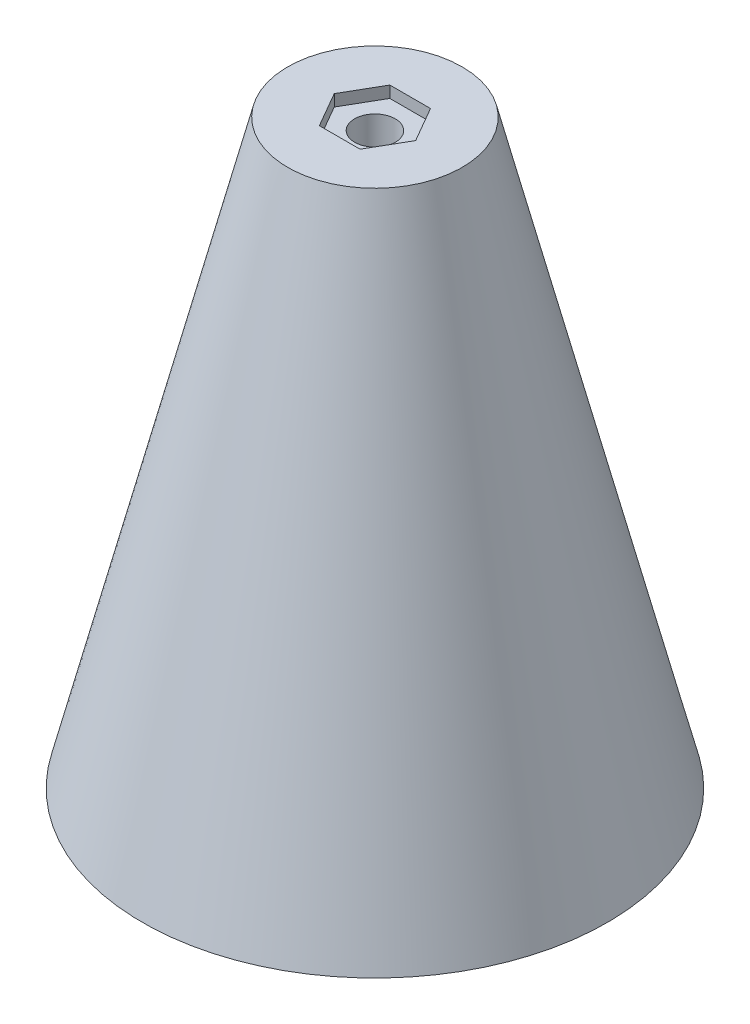
ISO-10303-21;
HEADER;
FILE_DESCRIPTION(('STEP AP214'),'2;1');
FILE_NAME('part.step','',(''),(''),'','','');
FILE_SCHEMA(('AUTOMOTIVE_DESIGN { 1 0 10303 214 1 1 1 1 }'));
ENDSEC;
DATA;
#1=APPLICATION_CONTEXT('core data for automotive mechanical design processes');
#2=APPLICATION_PROTOCOL_DEFINITION('international standard','automotive_design',2000,#1);
#3=PRODUCT_CONTEXT('',#1,'mechanical');
#4=PRODUCT('Part','Part','',(#3));
#5=PRODUCT_RELATED_PRODUCT_CATEGORY('part','',(#4));
#6=PRODUCT_DEFINITION_FORMATION('','',#4);
#7=PRODUCT_DEFINITION_CONTEXT('part definition',#1,'design');
#8=PRODUCT_DEFINITION('design','',#6,#7);
#9=PRODUCT_DEFINITION_SHAPE('','',#8);
#10=(LENGTH_UNIT() NAMED_UNIT(*) SI_UNIT(.MILLI.,.METRE.));
#11=(NAMED_UNIT(*) PLANE_ANGLE_UNIT() SI_UNIT($,.RADIAN.));
#12=(NAMED_UNIT(*) SI_UNIT($,.STERADIAN.) SOLID_ANGLE_UNIT());
#13=UNCERTAINTY_MEASURE_WITH_UNIT(LENGTH_MEASURE(1.E-05),#10,'distance_accuracy_value','');
#14=(GEOMETRIC_REPRESENTATION_CONTEXT(3) GLOBAL_UNCERTAINTY_ASSIGNED_CONTEXT((#13)) GLOBAL_UNIT_ASSIGNED_CONTEXT((#10,
#11,#12)) REPRESENTATION_CONTEXT('',''));
#15=CARTESIAN_POINT('',(0.,0.,0.));
#16=DIRECTION('',(0.,0.,1.));
#17=DIRECTION('',(1.,0.,0.));
#18=AXIS2_PLACEMENT_3D('',#15,#16,#17);
#19=CARTESIAN_POINT('',(0.,-10.,0.));
#20=DIRECTION('',(0.,1.,0.));
#21=DIRECTION('',(0.,0.,1.));
#22=AXIS2_PLACEMENT_3D('',#19,#20,#21);
#23=CYLINDRICAL_SURFACE('',#22,1.75);
#24=CARTESIAN_POINT('',(0.,-3.50000000000001,0.));
#25=DIRECTION('',(0.,1.,0.));
#26=DIRECTION('',(0.,0.,1.));
#27=AXIS2_PLACEMENT_3D('',#24,#25,#26);
#28=CIRCLE('',#27,1.75);
#29=CARTESIAN_POINT('',(0.,-3.50000000000001,1.75));
#30=VERTEX_POINT('',#29);
#31=EDGE_CURVE('E11',#30,#30,#28,.F.);
#32=ORIENTED_EDGE('',*,*,#31,.T.);
#33=EDGE_LOOP('',(#32));
#34=FACE_BOUND('',#33,.T.);
#35=CARTESIAN_POINT('',(0.,-0.999999999999999,0.));
#36=DIRECTION('',(0.,1.,0.));
#37=DIRECTION('',(0.,0.,1.));
#38=AXIS2_PLACEMENT_3D('',#35,#36,#37);
#39=CIRCLE('',#38,1.75);
#40=CARTESIAN_POINT('',(0.,-0.999999999999999,1.75));
#41=VERTEX_POINT('',#40);
#42=EDGE_CURVE('E141',#41,#41,#39,.F.);
#43=ORIENTED_EDGE('',*,*,#42,.F.);
#44=EDGE_LOOP('',(#43));
#45=FACE_BOUND('',#44,.T.);
#46=ADVANCED_FACE('F37',(#34,#45),#23,.F.);
#47=CARTESIAN_POINT('',(0.,0.,0.));
#48=DIRECTION('',(0.,-1.,0.));
#49=DIRECTION('',(0.,0.,-1.));
#50=AXIS2_PLACEMENT_3D('',#47,#48,#49);
#51=CONICAL_SURFACE('',#50,7.49999999999999,0.244978663126864);
#52=CARTESIAN_POINT('',(0.,-50.,0.));
#53=DIRECTION('',(0.,-1.,0.));
#54=DIRECTION('',(0.,0.,-1.));
#55=AXIS2_PLACEMENT_3D('',#52,#53,#54);
#56=CIRCLE('',#55,20.);
#57=CARTESIAN_POINT('',(0.,-50.,-20.));
#58=VERTEX_POINT('',#57);
#59=EDGE_CURVE('E147',#58,#58,#56,.T.);
#60=ORIENTED_EDGE('',*,*,#59,.F.);
#61=EDGE_LOOP('',(#60));
#62=FACE_BOUND('',#61,.T.);
#63=CARTESIAN_POINT('',(0.,0.,0.));
#64=DIRECTION('',(0.,-1.,0.));
#65=DIRECTION('',(0.,0.,-1.));
#66=AXIS2_PLACEMENT_3D('',#63,#64,#65);
#67=CIRCLE('',#66,7.49999999999999);
#68=CARTESIAN_POINT('',(0.,0.,-7.49999999999998));
#69=VERTEX_POINT('',#68);
#70=EDGE_CURVE('E156',#69,#69,#67,.T.);
#71=ORIENTED_EDGE('',*,*,#70,.T.);
#72=EDGE_LOOP('',(#71));
#73=FACE_BOUND('',#72,.T.);
#74=ADVANCED_FACE('F177',(#62,#73),#51,.T.);
#75=CARTESIAN_POINT('',(0.,0.,7.5));
#76=DIRECTION('',(0.,-1.,0.));
#77=DIRECTION('',(0.,0.,-1.));
#78=AXIS2_PLACEMENT_3D('',#75,#76,#77);
#79=PLANE('',#78);
#80=DIRECTION('',(-0.5,0.,-0.866025403784439));
#81=VECTOR('',#80,1.);
#82=CARTESIAN_POINT('',(3.5,0.,0.));
#83=LINE('',#82,#81);
#84=CARTESIAN_POINT('',(3.5,0.,0.));
#85=VERTEX_POINT('',#84);
#86=CARTESIAN_POINT('',(1.75,0.,-3.03108891324554));
#87=VERTEX_POINT('',#86);
#88=EDGE_CURVE('E128',#85,#87,#83,.T.);
#89=ORIENTED_EDGE('',*,*,#88,.F.);
#90=DIRECTION('',(0.5,0.,-0.866025403784439));
#91=VECTOR('',#90,1.);
#92=CARTESIAN_POINT('',(1.75,0.,3.03108891324554));
#93=LINE('',#92,#91);
#94=CARTESIAN_POINT('',(1.75,0.,3.03108891324554));
#95=VERTEX_POINT('',#94);
#96=EDGE_CURVE('E53',#95,#85,#93,.T.);
#97=ORIENTED_EDGE('',*,*,#96,.F.);
#98=DIRECTION('',(1.,0.,0.));
#99=VECTOR('',#98,1.);
#100=CARTESIAN_POINT('',(-1.75,0.,3.03108891324554));
#101=LINE('',#100,#99);
#102=CARTESIAN_POINT('',(-1.75,0.,3.03108891324554));
#103=VERTEX_POINT('',#102);
#104=EDGE_CURVE('E137',#103,#95,#101,.T.);
#105=ORIENTED_EDGE('',*,*,#104,.F.);
#106=DIRECTION('',(0.5,0.,0.866025403784439));
#107=VECTOR('',#106,1.);
#108=CARTESIAN_POINT('',(-3.5,0.,0.));
#109=LINE('',#108,#107);
#110=CARTESIAN_POINT('',(-3.5,0.,0.));
#111=VERTEX_POINT('',#110);
#112=EDGE_CURVE('E135',#111,#103,#109,.T.);
#113=ORIENTED_EDGE('',*,*,#112,.F.);
#114=DIRECTION('',(-0.5,0.,0.866025403784439));
#115=VECTOR('',#114,1.);
#116=CARTESIAN_POINT('',(-1.75,0.,-3.03108891324554));
#117=LINE('',#116,#115);
#118=CARTESIAN_POINT('',(-1.75,0.,-3.03108891324554));
#119=VERTEX_POINT('',#118);
#120=EDGE_CURVE('E101',#119,#111,#117,.T.);
#121=ORIENTED_EDGE('',*,*,#120,.F.);
#122=DIRECTION('',(-1.,0.,0.));
#123=VECTOR('',#122,1.);
#124=CARTESIAN_POINT('',(1.75,0.,-3.03108891324554));
#125=LINE('',#124,#123);
#126=EDGE_CURVE('E131',#87,#119,#125,.T.);
#127=ORIENTED_EDGE('',*,*,#126,.F.);
#128=EDGE_LOOP('',(#89,#97,#105,#113,#121,#127));
#129=FACE_BOUND('',#128,.T.);
#130=ORIENTED_EDGE('',*,*,#70,.F.);
#131=EDGE_LOOP('',(#130));
#132=FACE_BOUND('',#131,.T.);
#133=ADVANCED_FACE('F183',(#129,#132),#79,.F.);
#134=CARTESIAN_POINT('',(0.,-4.,0.));
#135=DIRECTION('',(0.,1.,0.));
#136=DIRECTION('',(0.,0.,1.));
#137=AXIS2_PLACEMENT_3D('',#134,#135,#136);
#138=PLANE('',#137);
#139=CARTESIAN_POINT('',(0.,-4.,0.));
#140=DIRECTION('',(0.,1.,0.));
#141=DIRECTION('',(0.,0.,1.));
#142=AXIS2_PLACEMENT_3D('',#139,#140,#141);
#143=CIRCLE('',#142,2.24999999999999);
#144=CARTESIAN_POINT('',(0.,-4.,2.24999999999999));
#145=VERTEX_POINT('',#144);
#146=EDGE_CURVE('E46',#145,#145,#143,.T.);
#147=ORIENTED_EDGE('',*,*,#146,.T.);
#148=EDGE_LOOP('',(#147));
#149=FACE_BOUND('',#148,.T.);
#150=CARTESIAN_POINT('',(0.,-4.,0.));
#151=DIRECTION('',(0.,-1.,0.));
#152=DIRECTION('',(0.,0.,-1.));
#153=AXIS2_PLACEMENT_3D('',#150,#151,#152);
#154=CIRCLE('',#153,4.49999999999999);
#155=CARTESIAN_POINT('',(0.,-4.,-4.49999999999998));
#156=VERTEX_POINT('',#155);
#157=EDGE_CURVE('E153',#156,#156,#154,.T.);
#158=ORIENTED_EDGE('',*,*,#157,.T.);
#159=EDGE_LOOP('',(#158));
#160=FACE_BOUND('',#159,.T.);
#161=ADVANCED_FACE('F163',(#149,#160),#138,.F.);
#162=CARTESIAN_POINT('',(0.,-50.,0.));
#163=DIRECTION('',(0.,-1.,0.));
#164=DIRECTION('',(0.,0.,-1.));
#165=AXIS2_PLACEMENT_3D('',#162,#163,#164);
#166=CONICAL_SURFACE('',#165,16.,0.244978663126864);
#167=CARTESIAN_POINT('',(0.,-50.,0.));
#168=DIRECTION('',(0.,-1.,0.));
#169=DIRECTION('',(0.,0.,-1.));
#170=AXIS2_PLACEMENT_3D('',#167,#168,#169);
#171=CIRCLE('',#170,16.);
#172=CARTESIAN_POINT('',(0.,-50.,-16.));
#173=VERTEX_POINT('',#172);
#174=EDGE_CURVE('E150',#173,#173,#171,.T.);
#175=CARTESIAN_POINT('',(0.,-4.,-4.49999999999998));
#176=CARTESIAN_POINT('',(0.,-4.47916666666667,-4.61979166666665));
#177=CARTESIAN_POINT('',(0.,-4.95833333333334,-4.73958333333332));
#178=CARTESIAN_POINT('',(0.,-5.91666666666667,-4.97916666666665));
#179=CARTESIAN_POINT('',(0.,-6.39583333333334,-5.09895833333331));
#180=CARTESIAN_POINT('',(0.,-7.35416666666667,-5.33854166666665));
#181=CARTESIAN_POINT('',(0.,-7.83333333333334,-5.45833333333332));
#182=CARTESIAN_POINT('',(0.,-8.79166666666667,-5.69791666666665));
#183=CARTESIAN_POINT('',(0.,-9.27083333333334,-5.81770833333331));
#184=CARTESIAN_POINT('',(0.,-10.2291666666667,-6.05729166666664));
#185=CARTESIAN_POINT('',(0.,-10.7083333333333,-6.17708333333331));
#186=CARTESIAN_POINT('',(0.,-11.6666666666667,-6.41666666666664));
#187=CARTESIAN_POINT('',(0.,-12.1458333333333,-6.53645833333331));
#188=CARTESIAN_POINT('',(0.,-13.1041666666667,-6.77604166666664));
#189=CARTESIAN_POINT('',(0.,-13.5833333333333,-6.89583333333331));
#190=CARTESIAN_POINT('',(0.,-14.5416666666667,-7.13541666666664));
#191=CARTESIAN_POINT('',(0.,-15.0208333333333,-7.25520833333331));
#192=CARTESIAN_POINT('',(0.,-15.9791666666667,-7.49479166666664));
#193=CARTESIAN_POINT('',(0.,-16.4583333333333,-7.61458333333331));
#194=CARTESIAN_POINT('',(0.,-17.4166666666667,-7.85416666666664));
#195=CARTESIAN_POINT('',(0.,-17.8958333333333,-7.97395833333331));
#196=CARTESIAN_POINT('',(0.,-18.8541666666667,-8.21354166666664));
#197=CARTESIAN_POINT('',(0.,-19.3333333333333,-8.33333333333331));
#198=CARTESIAN_POINT('',(0.,-20.2916666666667,-8.57291666666664));
#199=CARTESIAN_POINT('',(0.,-20.7708333333333,-8.69270833333331));
#200=CARTESIAN_POINT('',(0.,-21.7291666666667,-8.93229166666664));
#201=CARTESIAN_POINT('',(0.,-22.2083333333333,-9.05208333333331));
#202=CARTESIAN_POINT('',(0.,-23.1666666666667,-9.29166666666664));
#203=CARTESIAN_POINT('',(0.,-23.6458333333333,-9.41145833333331));
#204=CARTESIAN_POINT('',(0.,-24.6041666666667,-9.65104166666664));
#205=CARTESIAN_POINT('',(0.,-25.0833333333333,-9.77083333333331));
#206=CARTESIAN_POINT('',(0.,-26.0416666666667,-10.0104166666666));
#207=CARTESIAN_POINT('',(0.,-26.5208333333333,-10.1302083333333));
#208=CARTESIAN_POINT('',(0.,-27.4791666666667,-10.3697916666666));
#209=CARTESIAN_POINT('',(0.,-27.9583333333333,-10.4895833333333));
#210=CARTESIAN_POINT('',(0.,-28.9166666666667,-10.7291666666666));
#211=CARTESIAN_POINT('',(0.,-29.3958333333333,-10.8489583333333));
#212=CARTESIAN_POINT('',(0.,-30.3541666666667,-11.0885416666666));
#213=CARTESIAN_POINT('',(0.,-30.8333333333333,-11.2083333333333));
#214=CARTESIAN_POINT('',(0.,-31.7916666666667,-11.4479166666666));
#215=CARTESIAN_POINT('',(0.,-32.2708333333333,-11.5677083333333));
#216=CARTESIAN_POINT('',(0.,-33.2291666666667,-11.8072916666666));
#217=CARTESIAN_POINT('',(0.,-33.7083333333333,-11.9270833333333));
#218=CARTESIAN_POINT('',(0.,-34.6666666666667,-12.1666666666666));
#219=CARTESIAN_POINT('',(0.,-35.1458333333333,-12.2864583333333));
#220=CARTESIAN_POINT('',(0.,-36.1041666666667,-12.5260416666666));
#221=CARTESIAN_POINT('',(0.,-36.5833333333333,-12.6458333333333));
#222=CARTESIAN_POINT('',(0.,-37.5416666666667,-12.8854166666666));
#223=CARTESIAN_POINT('',(0.,-38.0208333333333,-13.0052083333333));
#224=CARTESIAN_POINT('',(0.,-38.9791666666667,-13.2447916666666));
#225=CARTESIAN_POINT('',(0.,-39.4583333333333,-13.3645833333333));
#226=CARTESIAN_POINT('',(0.,-40.4166666666667,-13.6041666666666));
#227=CARTESIAN_POINT('',(0.,-40.8958333333333,-13.7239583333333));
#228=CARTESIAN_POINT('',(0.,-41.8541666666667,-13.9635416666666));
#229=CARTESIAN_POINT('',(0.,-42.3333333333334,-14.0833333333333));
#230=CARTESIAN_POINT('',(0.,-43.2916666666667,-14.3229166666666));
#231=CARTESIAN_POINT('',(0.,-43.7708333333334,-14.4427083333333));
#232=CARTESIAN_POINT('',(0.,-44.7291666666667,-14.6822916666666));
#233=CARTESIAN_POINT('',(0.,-45.2083333333333,-14.8020833333333));
#234=CARTESIAN_POINT('',(0.,-46.1666666666667,-15.0416666666666));
#235=CARTESIAN_POINT('',(0.,-46.6458333333333,-15.1614583333333));
#236=CARTESIAN_POINT('',(0.,-47.6041666666667,-15.4010416666666));
#237=CARTESIAN_POINT('',(0.,-48.0833333333333,-15.5208333333333));
#238=CARTESIAN_POINT('',(0.,-49.0416666666667,-15.7604166666666));
#239=CARTESIAN_POINT('',(0.,-49.5208333333334,-15.8802083333333));
#240=CARTESIAN_POINT('',(0.,-50.,-16.));
#241=B_SPLINE_CURVE_WITH_KNOTS('',3,(#175,#176,#177,#178,#179,#180,#181,#182,#183,#184,#185,
#186,#187,#188,#189,#190,#191,#192,#193,#194,#195,#196,#197,#198,#199,#200,#201,#202,#203,#204,
#205,#206,#207,#208,#209,#210,#211,#212,#213,#214,#215,#216,#217,#218,#219,#220,#221,#222,#223,
#224,#225,#226,#227,#228,#229,#230,#231,#232,#233,#234,#235,#236,#237,#238,#239,#240),
.UNSPECIFIED.,.F.,.F.,(4,2,2,2,2,2,2,2,2,2,2,2,2,2,2,2,2,2,2,2,2,2,2,2,2,2,2,2,2,2,2,2,4),(0.,
1.48174108420635,2.9634821684127,4.44522325261904,5.92696433682539,7.40870542103173,
8.89044650523808,10.3721875894444,11.8539286736508,13.3356697578571,14.8174108420635,
16.2991519262698,17.7808930104762,19.2626340946825,20.7443751788889,22.2261162630952,
23.7078573473016,25.1895984315079,26.6713395157143,28.1530805999206,29.6348216841269,
31.1165627683333,32.5983038525396,34.080044936746,35.5617860209523,37.0435271051587,
38.525268189365,40.0070092735714,41.4887503577777,42.9704914419841,44.4522325261904,
45.9339736103967,47.4157146946031),.UNSPECIFIED.);
#242=EDGE_CURVE('BSEAM192',#156,#173,#241,.T.);
#243=ORIENTED_EDGE('',*,*,#157,.F.);
#244=ORIENTED_EDGE('',*,*,#174,.T.);
#245=ORIENTED_EDGE('',*,*,#242,.T.);
#246=ORIENTED_EDGE('',*,*,#242,.F.);
#247=EDGE_LOOP('',(#243,#245,#244,#246));
#248=FACE_BOUND('',#247,.T.);
#249=ADVANCED_FACE('F192',(#248),#166,.F.);
#250=CARTESIAN_POINT('',(0.,-50.,16.));
#251=DIRECTION('',(0.,1.,0.));
#252=DIRECTION('',(0.,0.,1.));
#253=AXIS2_PLACEMENT_3D('',#250,#251,#252);
#254=PLANE('',#253);
#255=ORIENTED_EDGE('',*,*,#174,.F.);
#256=EDGE_LOOP('',(#255));
#257=FACE_BOUND('',#256,.T.);
#258=ORIENTED_EDGE('',*,*,#59,.T.);
#259=EDGE_LOOP('',(#258));
#260=FACE_BOUND('',#259,.T.);
#261=ADVANCED_FACE('F189',(#257,#260),#254,.F.);
#262=CARTESIAN_POINT('',(0.,-1.,0.));
#263=DIRECTION('',(0.,1.,0.));
#264=DIRECTION('',(0.,0.,1.));
#265=AXIS2_PLACEMENT_3D('',#262,#263,#264);
#266=PLANE('',#265);
#267=DIRECTION('',(0.5,0.,-0.866025403784439));
#268=VECTOR('',#267,1.);
#269=CARTESIAN_POINT('',(1.75,-0.999999999999999,3.03108891324554));
#270=LINE('',#269,#268);
#271=CARTESIAN_POINT('',(1.75,-0.999999999999999,3.03108891324554));
#272=VERTEX_POINT('',#271);
#273=CARTESIAN_POINT('',(3.5,-1.,0.));
#274=VERTEX_POINT('',#273);
#275=EDGE_CURVE('E139',#272,#274,#270,.T.);
#276=ORIENTED_EDGE('',*,*,#275,.T.);
#277=DIRECTION('',(-0.5,0.,-0.866025403784439));
#278=VECTOR('',#277,1.);
#279=CARTESIAN_POINT('',(3.5,-1.,0.));
#280=LINE('',#279,#278);
#281=CARTESIAN_POINT('',(1.75,-1.,-3.03108891324554));
#282=VERTEX_POINT('',#281);
#283=EDGE_CURVE('E122',#274,#282,#280,.T.);
#284=ORIENTED_EDGE('',*,*,#283,.T.);
#285=DIRECTION('',(-1.,0.,0.));
#286=VECTOR('',#285,1.);
#287=CARTESIAN_POINT('',(1.75,-1.,-3.03108891324554));
#288=LINE('',#287,#286);
#289=CARTESIAN_POINT('',(-1.75,-1.,-3.03108891324554));
#290=VERTEX_POINT('',#289);
#291=EDGE_CURVE('E120',#282,#290,#288,.T.);
#292=ORIENTED_EDGE('',*,*,#291,.T.);
#293=DIRECTION('',(-0.5,0.,0.866025403784439));
#294=VECTOR('',#293,1.);
#295=CARTESIAN_POINT('',(-1.75,-1.,-3.03108891324554));
#296=LINE('',#295,#294);
#297=CARTESIAN_POINT('',(-3.5,-1.,0.));
#298=VERTEX_POINT('',#297);
#299=EDGE_CURVE('E98',#290,#298,#296,.T.);
#300=ORIENTED_EDGE('',*,*,#299,.T.);
#301=DIRECTION('',(0.5,0.,0.866025403784439));
#302=VECTOR('',#301,1.);
#303=CARTESIAN_POINT('',(-3.5,-1.,0.));
#304=LINE('',#303,#302);
#305=CARTESIAN_POINT('',(-1.75,-0.999999999999999,3.03108891324554));
#306=VERTEX_POINT('',#305);
#307=EDGE_CURVE('E109',#298,#306,#304,.T.);
#308=ORIENTED_EDGE('',*,*,#307,.T.);
#309=DIRECTION('',(1.,0.,0.));
#310=VECTOR('',#309,1.);
#311=CARTESIAN_POINT('',(-1.75,-0.999999999999999,3.03108891324554));
#312=LINE('',#311,#310);
#313=EDGE_CURVE('E113',#306,#272,#312,.T.);
#314=ORIENTED_EDGE('',*,*,#313,.T.);
#315=EDGE_LOOP('',(#276,#284,#292,#300,#308,#314));
#316=FACE_BOUND('',#315,.T.);
#317=ORIENTED_EDGE('',*,*,#42,.T.);
#318=EDGE_LOOP('',(#317));
#319=FACE_BOUND('',#318,.T.);
#320=ADVANCED_FACE('F116',(#316,#319),#266,.T.);
#321=CARTESIAN_POINT('',(1.75,-0.999999999999999,3.03108891324554));
#322=DIRECTION('',(0.866025403784439,0.,0.5));
#323=DIRECTION('',(0.5,0.,-0.866025403784439));
#324=AXIS2_PLACEMENT_3D('',#321,#322,#323);
#325=PLANE('',#324);
#326=ORIENTED_EDGE('',*,*,#96,.T.);
#327=DIRECTION('',(0.,1.,0.));
#328=VECTOR('',#327,1.);
#329=CARTESIAN_POINT('',(3.5,-1.,0.));
#330=LINE('',#329,#328);
#331=EDGE_CURVE('E83',#274,#85,#330,.T.);
#332=ORIENTED_EDGE('',*,*,#331,.F.);
#333=ORIENTED_EDGE('',*,*,#275,.F.);
#334=DIRECTION('',(0.,1.,0.));
#335=VECTOR('',#334,1.);
#336=CARTESIAN_POINT('',(1.75,-0.999999999999999,3.03108891324554));
#337=LINE('',#336,#335);
#338=EDGE_CURVE('E61',#272,#95,#337,.T.);
#339=ORIENTED_EDGE('',*,*,#338,.T.);
#340=EDGE_LOOP('',(#326,#332,#333,#339));
#341=FACE_BOUND('',#340,.T.);
#342=ADVANCED_FACE('F188',(#341),#325,.F.);
#343=CARTESIAN_POINT('',(-1.75,-0.999999999999999,3.03108891324554));
#344=DIRECTION('',(0.,0.,1.));
#345=DIRECTION('',(0.,-1.,0.));
#346=AXIS2_PLACEMENT_3D('',#343,#344,#345);
#347=PLANE('',#346);
#348=ORIENTED_EDGE('',*,*,#104,.T.);
#349=ORIENTED_EDGE('',*,*,#338,.F.);
#350=ORIENTED_EDGE('',*,*,#313,.F.);
#351=DIRECTION('',(0.,1.,0.));
#352=VECTOR('',#351,1.);
#353=CARTESIAN_POINT('',(-1.75,-0.999999999999999,3.03108891324554));
#354=LINE('',#353,#352);
#355=EDGE_CURVE('E105',#306,#103,#354,.T.);
#356=ORIENTED_EDGE('',*,*,#355,.T.);
#357=EDGE_LOOP('',(#348,#349,#350,#356));
#358=FACE_BOUND('',#357,.T.);
#359=ADVANCED_FACE('F211',(#358),#347,.F.);
#360=CARTESIAN_POINT('',(-3.5,-1.,0.));
#361=DIRECTION('',(-0.866025403784439,0.,0.5));
#362=DIRECTION('',(0.5,0.,0.866025403784439));
#363=AXIS2_PLACEMENT_3D('',#360,#361,#362);
#364=PLANE('',#363);
#365=ORIENTED_EDGE('',*,*,#112,.T.);
#366=ORIENTED_EDGE('',*,*,#355,.F.);
#367=ORIENTED_EDGE('',*,*,#307,.F.);
#368=DIRECTION('',(0.,1.,0.));
#369=VECTOR('',#368,1.);
#370=CARTESIAN_POINT('',(-3.5,-1.,0.));
#371=LINE('',#370,#369);
#372=EDGE_CURVE('E94',#298,#111,#371,.T.);
#373=ORIENTED_EDGE('',*,*,#372,.T.);
#374=EDGE_LOOP('',(#365,#366,#367,#373));
#375=FACE_BOUND('',#374,.T.);
#376=ADVANCED_FACE('F110',(#375),#364,.F.);
#377=CARTESIAN_POINT('',(-1.75,-1.,-3.03108891324554));
#378=DIRECTION('',(-0.866025403784439,0.,-0.5));
#379=DIRECTION('',(-0.5,0.,0.866025403784439));
#380=AXIS2_PLACEMENT_3D('',#377,#378,#379);
#381=PLANE('',#380);
#382=ORIENTED_EDGE('',*,*,#120,.T.);
#383=ORIENTED_EDGE('',*,*,#372,.F.);
#384=ORIENTED_EDGE('',*,*,#299,.F.);
#385=DIRECTION('',(0.,1.,0.));
#386=VECTOR('',#385,1.);
#387=CARTESIAN_POINT('',(-1.75,-1.,-3.03108891324554));
#388=LINE('',#387,#386);
#389=EDGE_CURVE('E106',#290,#119,#388,.T.);
#390=ORIENTED_EDGE('',*,*,#389,.T.);
#391=EDGE_LOOP('',(#382,#383,#384,#390));
#392=FACE_BOUND('',#391,.T.);
#393=ADVANCED_FACE('F96',(#392),#381,.F.);
#394=CARTESIAN_POINT('',(1.75,-1.,-3.03108891324554));
#395=DIRECTION('',(0.,0.,-1.));
#396=DIRECTION('',(0.,1.,0.));
#397=AXIS2_PLACEMENT_3D('',#394,#395,#396);
#398=PLANE('',#397);
#399=ORIENTED_EDGE('',*,*,#126,.T.);
#400=ORIENTED_EDGE('',*,*,#389,.F.);
#401=ORIENTED_EDGE('',*,*,#291,.F.);
#402=DIRECTION('',(0.,1.,0.));
#403=VECTOR('',#402,1.);
#404=CARTESIAN_POINT('',(1.75,-1.,-3.03108891324554));
#405=LINE('',#404,#403);
#406=EDGE_CURVE('E144',#282,#87,#405,.T.);
#407=ORIENTED_EDGE('',*,*,#406,.T.);
#408=EDGE_LOOP('',(#399,#400,#401,#407));
#409=FACE_BOUND('',#408,.T.);
#410=ADVANCED_FACE('F172',(#409),#398,.F.);
#411=CARTESIAN_POINT('',(3.5,-1.,0.));
#412=DIRECTION('',(0.866025403784439,0.,-0.5));
#413=DIRECTION('',(-0.5,0.,-0.866025403784439));
#414=AXIS2_PLACEMENT_3D('',#411,#412,#413);
#415=PLANE('',#414);
#416=ORIENTED_EDGE('',*,*,#88,.T.);
#417=ORIENTED_EDGE('',*,*,#406,.F.);
#418=ORIENTED_EDGE('',*,*,#283,.F.);
#419=ORIENTED_EDGE('',*,*,#331,.T.);
#420=EDGE_LOOP('',(#416,#417,#418,#419));
#421=FACE_BOUND('',#420,.T.);
#422=ADVANCED_FACE('F167',(#421),#415,.F.);
#423=CARTESIAN_POINT('',(0.,-4.,0.));
#424=DIRECTION('',(0.,-1.,0.));
#425=DIRECTION('',(0.,0.,-1.));
#426=AXIS2_PLACEMENT_3D('',#423,#424,#425);
#427=CONICAL_SURFACE('',#426,2.24999999999999,0.785398163397448);
#428=ORIENTED_EDGE('',*,*,#31,.F.);
#429=EDGE_LOOP('',(#428));
#430=FACE_BOUND('',#429,.T.);
#431=ORIENTED_EDGE('',*,*,#146,.F.);
#432=EDGE_LOOP('',(#431));
#433=FACE_BOUND('',#432,.T.);
#434=ADVANCED_FACE('F40',(#430,#433),#427,.F.);
#435=CLOSED_SHELL('',(#46,#74,#133,#161,#249,#261,#320,#342,#359,#376,#393,#410,#422,#434));
#436=MANIFOLD_SOLID_BREP('B2',#435);
#437=ADVANCED_BREP_SHAPE_REPRESENTATION('',(#18,#436),#14);
#438=SHAPE_DEFINITION_REPRESENTATION(#9,#437);
ENDSEC;
END-ISO-10303-21;
